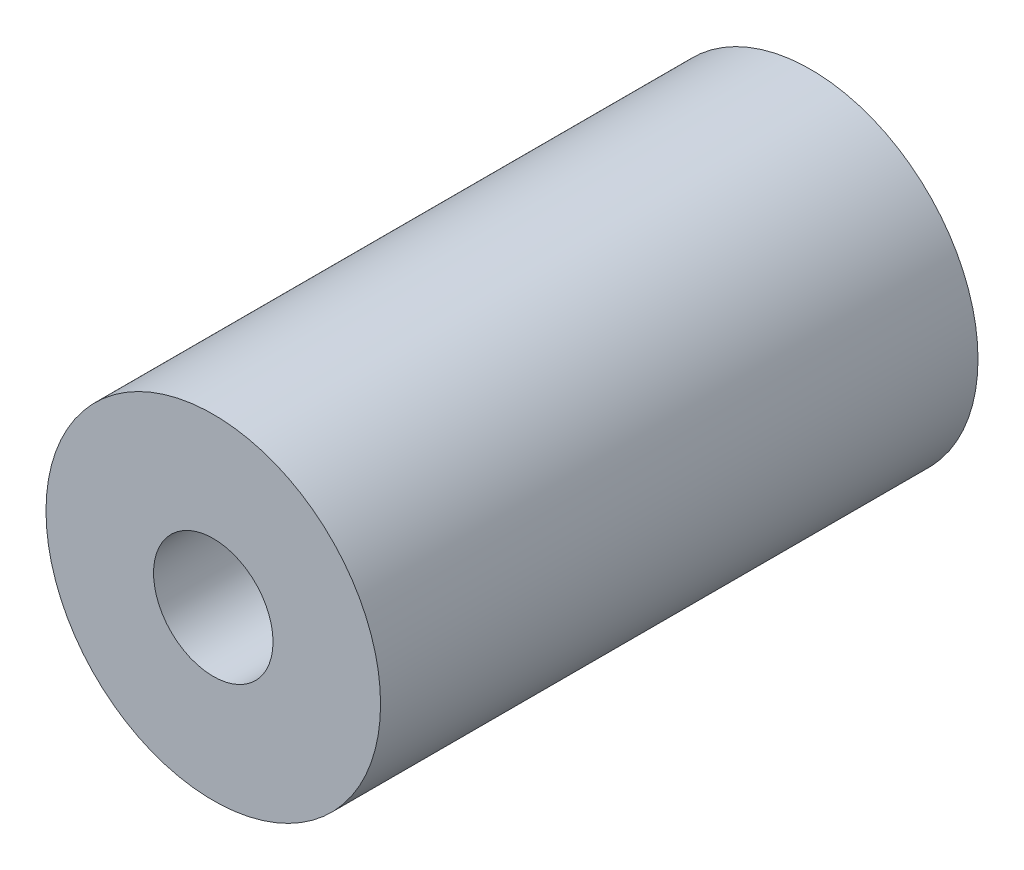
ISO-10303-21;
HEADER;
FILE_DESCRIPTION(('STEP AP214'),'2;1');
FILE_NAME('part.step','',(''),(''),'','','');
FILE_SCHEMA(('AUTOMOTIVE_DESIGN { 1 0 10303 214 1 1 1 1 }'));
ENDSEC;
DATA;
#1=APPLICATION_CONTEXT('core data for automotive mechanical design processes');
#2=APPLICATION_PROTOCOL_DEFINITION('international standard','automotive_design',2000,#1);
#3=PRODUCT_CONTEXT('',#1,'mechanical');
#4=PRODUCT('Part','Part','',(#3));
#5=PRODUCT_RELATED_PRODUCT_CATEGORY('part','',(#4));
#6=PRODUCT_DEFINITION_FORMATION('','',#4);
#7=PRODUCT_DEFINITION_CONTEXT('part definition',#1,'design');
#8=PRODUCT_DEFINITION('design','',#6,#7);
#9=PRODUCT_DEFINITION_SHAPE('','',#8);
#10=(LENGTH_UNIT() NAMED_UNIT(*) SI_UNIT(.MILLI.,.METRE.));
#11=(NAMED_UNIT(*) PLANE_ANGLE_UNIT() SI_UNIT($,.RADIAN.));
#12=(NAMED_UNIT(*) SI_UNIT($,.STERADIAN.) SOLID_ANGLE_UNIT());
#13=UNCERTAINTY_MEASURE_WITH_UNIT(LENGTH_MEASURE(1.E-05),#10,'distance_accuracy_value','');
#14=(GEOMETRIC_REPRESENTATION_CONTEXT(3) GLOBAL_UNCERTAINTY_ASSIGNED_CONTEXT((#13)) GLOBAL_UNIT_ASSIGNED_CONTEXT((#10,
#11,#12)) REPRESENTATION_CONTEXT('',''));
#15=CARTESIAN_POINT('',(0.,0.,0.));
#16=DIRECTION('',(0.,0.,1.));
#17=DIRECTION('',(1.,0.,0.));
#18=AXIS2_PLACEMENT_3D('',#15,#16,#17);
#19=CARTESIAN_POINT('',(0.,0.,25.));
#20=DIRECTION('',(0.,0.,1.));
#21=DIRECTION('',(1.,0.,0.));
#22=AXIS2_PLACEMENT_3D('',#19,#20,#21);
#23=PLANE('',#22);
#24=CARTESIAN_POINT('',(0.,0.,25.));
#25=DIRECTION('',(0.,0.,1.));
#26=DIRECTION('',(1.,0.,0.));
#27=AXIS2_PLACEMENT_3D('',#24,#25,#26);
#28=CIRCLE('',#27,7.00000000000001);
#29=CARTESIAN_POINT('',(7.00000000000001,0.,25.));
#30=VERTEX_POINT('',#29);
#31=EDGE_CURVE('E10',#30,#30,#28,.T.);
#32=ORIENTED_EDGE('',*,*,#31,.T.);
#33=EDGE_LOOP('',(#32));
#34=FACE_BOUND('',#33,.T.);
#35=CARTESIAN_POINT('',(0.,0.,25.));
#36=DIRECTION('',(0.,0.,1.));
#37=DIRECTION('',(1.,0.,0.));
#38=AXIS2_PLACEMENT_3D('',#35,#36,#37);
#39=CIRCLE('',#38,2.5);
#40=CARTESIAN_POINT('',(2.5,0.,25.));
#41=VERTEX_POINT('',#40);
#42=EDGE_CURVE('E44',#41,#41,#39,.T.);
#43=ORIENTED_EDGE('',*,*,#42,.F.);
#44=EDGE_LOOP('',(#43));
#45=FACE_BOUND('',#44,.T.);
#46=ADVANCED_FACE('F33',(#34,#45),#23,.T.);
#47=CARTESIAN_POINT('',(0.,0.,0.));
#48=DIRECTION('',(0.,0.,1.));
#49=DIRECTION('',(1.,0.,0.));
#50=AXIS2_PLACEMENT_3D('',#47,#48,#49);
#51=PLANE('',#50);
#52=CARTESIAN_POINT('',(0.,0.,0.));
#53=DIRECTION('',(0.,0.,1.));
#54=DIRECTION('',(1.,0.,0.));
#55=AXIS2_PLACEMENT_3D('',#52,#53,#54);
#56=CIRCLE('',#55,7.00000000000001);
#57=CARTESIAN_POINT('',(7.00000000000001,0.,0.));
#58=VERTEX_POINT('',#57);
#59=EDGE_CURVE('E37',#58,#58,#56,.T.);
#60=ORIENTED_EDGE('',*,*,#59,.F.);
#61=EDGE_LOOP('',(#60));
#62=FACE_BOUND('',#61,.T.);
#63=CARTESIAN_POINT('',(0.,0.,0.));
#64=DIRECTION('',(0.,0.,1.));
#65=DIRECTION('',(1.,0.,0.));
#66=AXIS2_PLACEMENT_3D('',#63,#64,#65);
#67=CIRCLE('',#66,2.5);
#68=CARTESIAN_POINT('',(2.5,0.,0.));
#69=VERTEX_POINT('',#68);
#70=EDGE_CURVE('E46',#69,#69,#67,.T.);
#71=ORIENTED_EDGE('',*,*,#70,.T.);
#72=EDGE_LOOP('',(#71));
#73=FACE_BOUND('',#72,.T.);
#74=ADVANCED_FACE('F56',(#62,#73),#51,.F.);
#75=CARTESIAN_POINT('',(0.,0.,25.));
#76=DIRECTION('',(0.,0.,-1.));
#77=DIRECTION('',(-1.,0.,0.));
#78=AXIS2_PLACEMENT_3D('',#75,#76,#77);
#79=CYLINDRICAL_SURFACE('',#78,7.00000000000001);
#80=ORIENTED_EDGE('',*,*,#31,.F.);
#81=EDGE_LOOP('',(#80));
#82=FACE_BOUND('',#81,.T.);
#83=ORIENTED_EDGE('',*,*,#59,.T.);
#84=EDGE_LOOP('',(#83));
#85=FACE_BOUND('',#84,.T.);
#86=ADVANCED_FACE('F35',(#82,#85),#79,.T.);
#87=CARTESIAN_POINT('',(0.,0.,25.));
#88=DIRECTION('',(0.,0.,-1.));
#89=DIRECTION('',(-1.,0.,0.));
#90=AXIS2_PLACEMENT_3D('',#87,#88,#89);
#91=CYLINDRICAL_SURFACE('',#90,2.5);
#92=ORIENTED_EDGE('',*,*,#42,.T.);
#93=EDGE_LOOP('',(#92));
#94=FACE_BOUND('',#93,.T.);
#95=ORIENTED_EDGE('',*,*,#70,.F.);
#96=EDGE_LOOP('',(#95));
#97=FACE_BOUND('',#96,.T.);
#98=ADVANCED_FACE('F52',(#94,#97),#91,.F.);
#99=CLOSED_SHELL('',(#46,#74,#86,#98));
#100=MANIFOLD_SOLID_BREP('B2',#99);
#101=ADVANCED_BREP_SHAPE_REPRESENTATION('',(#18,#100),#14);
#102=SHAPE_DEFINITION_REPRESENTATION(#9,#101);
ENDSEC;
END-ISO-10303-21;
